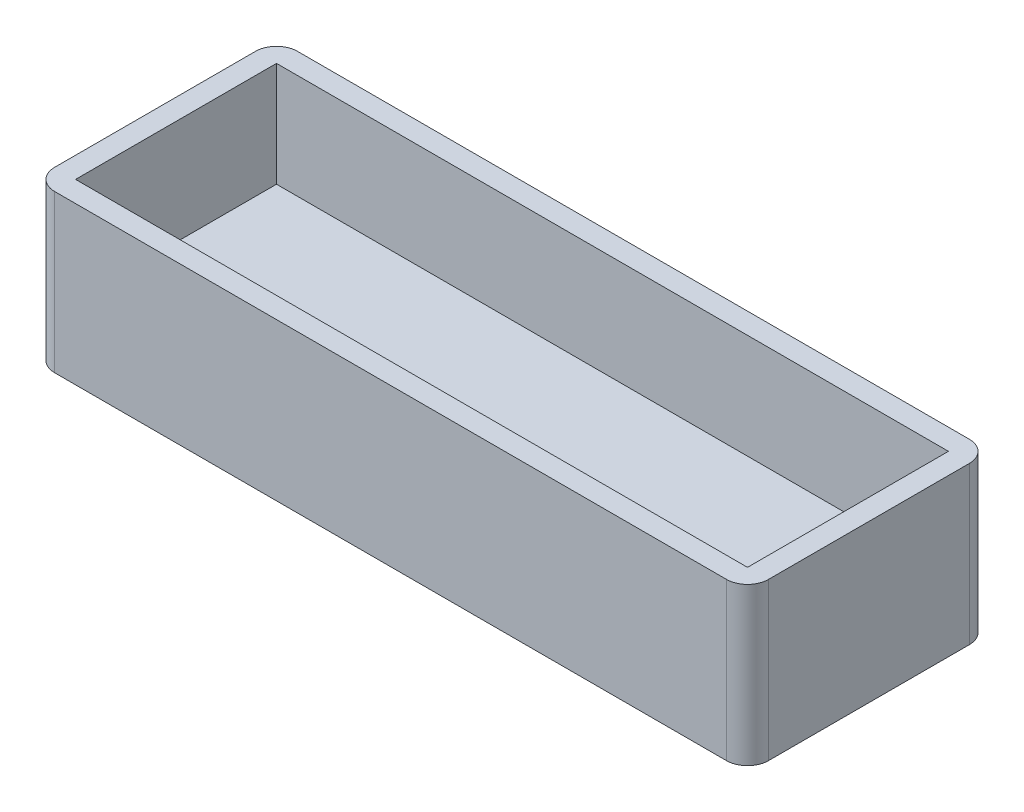
ISO-10303-21;
HEADER;
FILE_DESCRIPTION(('STEP AP214'),'2;1');
FILE_NAME('part.step','',(''),(''),'','','');
FILE_SCHEMA(('AUTOMOTIVE_DESIGN { 1 0 10303 214 1 1 1 1 }'));
ENDSEC;
DATA;
#1=APPLICATION_CONTEXT('core data for automotive mechanical design processes');
#2=APPLICATION_PROTOCOL_DEFINITION('international standard','automotive_design',2000,#1);
#3=PRODUCT_CONTEXT('',#1,'mechanical');
#4=PRODUCT('Part','Part','',(#3));
#5=PRODUCT_RELATED_PRODUCT_CATEGORY('part','',(#4));
#6=PRODUCT_DEFINITION_FORMATION('','',#4);
#7=PRODUCT_DEFINITION_CONTEXT('part definition',#1,'design');
#8=PRODUCT_DEFINITION('design','',#6,#7);
#9=PRODUCT_DEFINITION_SHAPE('','',#8);
#10=(LENGTH_UNIT() NAMED_UNIT(*) SI_UNIT(.MILLI.,.METRE.));
#11=(NAMED_UNIT(*) PLANE_ANGLE_UNIT() SI_UNIT($,.RADIAN.));
#12=(NAMED_UNIT(*) SI_UNIT($,.STERADIAN.) SOLID_ANGLE_UNIT());
#13=UNCERTAINTY_MEASURE_WITH_UNIT(LENGTH_MEASURE(1.E-05),#10,'distance_accuracy_value','');
#14=(GEOMETRIC_REPRESENTATION_CONTEXT(3) GLOBAL_UNCERTAINTY_ASSIGNED_CONTEXT((#13)) GLOBAL_UNIT_ASSIGNED_CONTEXT((#10,
#11,#12)) REPRESENTATION_CONTEXT('',''));
#15=CARTESIAN_POINT('',(0.,0.,0.));
#16=DIRECTION('',(0.,0.,1.));
#17=DIRECTION('',(1.,0.,0.));
#18=AXIS2_PLACEMENT_3D('',#15,#16,#17);
#19=CARTESIAN_POINT('',(0.,10.,0.));
#20=DIRECTION('',(0.,1.,0.));
#21=DIRECTION('',(0.,0.,1.));
#22=AXIS2_PLACEMENT_3D('',#19,#20,#21);
#23=PLANE('',#22);
#24=DIRECTION('',(-1.,0.,0.));
#25=VECTOR('',#24,1.);
#26=CARTESIAN_POINT('',(-2.,10.,-21.2));
#27=LINE('',#26,#25);
#28=CARTESIAN_POINT('',(64.2,10.,-21.2));
#29=VERTEX_POINT('',#28);
#30=CARTESIAN_POINT('',(0.,10.,-21.2));
#31=VERTEX_POINT('',#30);
#32=EDGE_CURVE('E173',#29,#31,#27,.T.);
#33=ORIENTED_EDGE('',*,*,#32,.T.);
#34=CARTESIAN_POINT('',(0.,10.,-19.2));
#35=DIRECTION('',(0.,1.,0.));
#36=DIRECTION('',(0.,0.,1.));
#37=AXIS2_PLACEMENT_3D('',#34,#35,#36);
#38=CIRCLE('',#37,2.);
#39=CARTESIAN_POINT('',(-2.,10.,-19.2));
#40=VERTEX_POINT('',#39);
#41=EDGE_CURVE('E208',#31,#40,#38,.T.);
#42=ORIENTED_EDGE('',*,*,#41,.T.);
#43=DIRECTION('',(0.,0.,1.));
#44=VECTOR('',#43,1.);
#45=CARTESIAN_POINT('',(-2.,10.,2.));
#46=LINE('',#45,#44);
#47=CARTESIAN_POINT('',(-2.,10.,0.));
#48=VERTEX_POINT('',#47);
#49=EDGE_CURVE('E176',#40,#48,#46,.T.);
#50=ORIENTED_EDGE('',*,*,#49,.T.);
#51=CARTESIAN_POINT('',(0.,10.,0.));
#52=DIRECTION('',(0.,1.,0.));
#53=DIRECTION('',(0.,0.,1.));
#54=AXIS2_PLACEMENT_3D('',#51,#52,#53);
#55=CIRCLE('',#54,2.);
#56=CARTESIAN_POINT('',(0.,10.,2.));
#57=VERTEX_POINT('',#56);
#58=EDGE_CURVE('E206',#48,#57,#55,.T.);
#59=ORIENTED_EDGE('',*,*,#58,.T.);
#60=DIRECTION('',(1.,0.,0.));
#61=VECTOR('',#60,1.);
#62=CARTESIAN_POINT('',(-2.,10.,2.));
#63=LINE('',#62,#61);
#64=CARTESIAN_POINT('',(64.2,10.,2.));
#65=VERTEX_POINT('',#64);
#66=EDGE_CURVE('E169',#57,#65,#63,.T.);
#67=ORIENTED_EDGE('',*,*,#66,.T.);
#68=CARTESIAN_POINT('',(64.2,10.,0.));
#69=DIRECTION('',(0.,1.,0.));
#70=DIRECTION('',(0.,0.,1.));
#71=AXIS2_PLACEMENT_3D('',#68,#69,#70);
#72=CIRCLE('',#71,2.);
#73=CARTESIAN_POINT('',(66.2,10.,0.));
#74=VERTEX_POINT('',#73);
#75=EDGE_CURVE('E63',#65,#74,#72,.T.);
#76=ORIENTED_EDGE('',*,*,#75,.T.);
#77=DIRECTION('',(0.,0.,-1.));
#78=VECTOR('',#77,1.);
#79=CARTESIAN_POINT('',(66.2,10.,2.));
#80=LINE('',#79,#78);
#81=CARTESIAN_POINT('',(66.2,10.,-19.2));
#82=VERTEX_POINT('',#81);
#83=EDGE_CURVE('E171',#74,#82,#80,.T.);
#84=ORIENTED_EDGE('',*,*,#83,.T.);
#85=CARTESIAN_POINT('',(64.2,10.,-19.2));
#86=DIRECTION('',(0.,1.,0.));
#87=DIRECTION('',(0.,0.,1.));
#88=AXIS2_PLACEMENT_3D('',#85,#86,#87);
#89=CIRCLE('',#88,2.);
#90=EDGE_CURVE('E204',#82,#29,#89,.T.);
#91=ORIENTED_EDGE('',*,*,#90,.T.);
#92=EDGE_LOOP('',(#33,#42,#50,#59,#67,#76,#84,#91));
#93=FACE_BOUND('',#92,.T.);
#94=DIRECTION('',(1.,0.,0.));
#95=VECTOR('',#94,1.);
#96=CARTESIAN_POINT('',(0.,10.,0.));
#97=LINE('',#96,#95);
#98=CARTESIAN_POINT('',(0.,10.,0.));
#99=VERTEX_POINT('',#98);
#100=CARTESIAN_POINT('',(64.2,10.,0.));
#101=VERTEX_POINT('',#100);
#102=EDGE_CURVE('E160',#99,#101,#97,.T.);
#103=ORIENTED_EDGE('',*,*,#102,.F.);
#104=DIRECTION('',(0.,0.,1.));
#105=VECTOR('',#104,1.);
#106=CARTESIAN_POINT('',(0.,10.,0.));
#107=LINE('',#106,#105);
#108=CARTESIAN_POINT('',(0.,10.,-19.2));
#109=VERTEX_POINT('',#108);
#110=EDGE_CURVE('E158',#109,#99,#107,.T.);
#111=ORIENTED_EDGE('',*,*,#110,.F.);
#112=DIRECTION('',(-1.,0.,0.));
#113=VECTOR('',#112,1.);
#114=CARTESIAN_POINT('',(0.,10.,-19.2));
#115=LINE('',#114,#113);
#116=CARTESIAN_POINT('',(64.2,10.,-19.2));
#117=VERTEX_POINT('',#116);
#118=EDGE_CURVE('E139',#117,#109,#115,.T.);
#119=ORIENTED_EDGE('',*,*,#118,.F.);
#120=DIRECTION('',(0.,0.,-1.));
#121=VECTOR('',#120,1.);
#122=CARTESIAN_POINT('',(64.2,10.,0.));
#123=LINE('',#122,#121);
#124=EDGE_CURVE('E234',#101,#117,#123,.T.);
#125=ORIENTED_EDGE('',*,*,#124,.F.);
#126=EDGE_LOOP('',(#103,#111,#119,#125));
#127=FACE_BOUND('',#126,.T.);
#128=ADVANCED_FACE('F43',(#93,#127),#23,.T.);
#129=CARTESIAN_POINT('',(-2.,10.,2.));
#130=DIRECTION('',(0.,0.,-1.));
#131=DIRECTION('',(-1.,0.,0.));
#132=AXIS2_PLACEMENT_3D('',#129,#130,#131);
#133=PLANE('',#132);
#134=ORIENTED_EDGE('',*,*,#66,.F.);
#135=DIRECTION('',(0.,-1.,0.));
#136=VECTOR('',#135,1.);
#137=CARTESIAN_POINT('',(0.,10.,2.));
#138=LINE('',#137,#136);
#139=CARTESIAN_POINT('',(0.,-5.,2.));
#140=VERTEX_POINT('',#139);
#141=EDGE_CURVE('E212',#57,#140,#138,.T.);
#142=ORIENTED_EDGE('',*,*,#141,.T.);
#143=DIRECTION('',(1.,0.,0.));
#144=VECTOR('',#143,1.);
#145=CARTESIAN_POINT('',(0.,-5.,2.));
#146=LINE('',#145,#144);
#147=CARTESIAN_POINT('',(64.2,-5.,2.));
#148=VERTEX_POINT('',#147);
#149=EDGE_CURVE('E226',#140,#148,#146,.T.);
#150=ORIENTED_EDGE('',*,*,#149,.T.);
#151=DIRECTION('',(0.,-1.,0.));
#152=VECTOR('',#151,1.);
#153=CARTESIAN_POINT('',(64.2,10.,2.));
#154=LINE('',#153,#152);
#155=EDGE_CURVE('E210',#148,#65,#154,.F.);
#156=ORIENTED_EDGE('',*,*,#155,.T.);
#157=EDGE_LOOP('',(#134,#142,#150,#156));
#158=FACE_BOUND('',#157,.T.);
#159=ADVANCED_FACE('F246',(#158),#133,.F.);
#160=CARTESIAN_POINT('',(66.2,10.,2.));
#161=DIRECTION('',(-1.,0.,0.));
#162=DIRECTION('',(0.,0.,1.));
#163=AXIS2_PLACEMENT_3D('',#160,#161,#162);
#164=PLANE('',#163);
#165=DIRECTION('',(0.,0.,-1.));
#166=VECTOR('',#165,1.);
#167=CARTESIAN_POINT('',(66.2,-5.,0.));
#168=LINE('',#167,#166);
#169=CARTESIAN_POINT('',(66.2,-5.,0.));
#170=VERTEX_POINT('',#169);
#171=CARTESIAN_POINT('',(66.2,-5.,-19.2));
#172=VERTEX_POINT('',#171);
#173=EDGE_CURVE('E218',#170,#172,#168,.T.);
#174=ORIENTED_EDGE('',*,*,#173,.T.);
#175=DIRECTION('',(0.,-1.,0.));
#176=VECTOR('',#175,1.);
#177=CARTESIAN_POINT('',(66.2,10.,-19.2));
#178=LINE('',#177,#176);
#179=EDGE_CURVE('E11',#172,#82,#178,.F.);
#180=ORIENTED_EDGE('',*,*,#179,.T.);
#181=ORIENTED_EDGE('',*,*,#83,.F.);
#182=DIRECTION('',(0.,-1.,0.));
#183=VECTOR('',#182,1.);
#184=CARTESIAN_POINT('',(66.2,10.,0.));
#185=LINE('',#184,#183);
#186=EDGE_CURVE('E51',#74,#170,#185,.T.);
#187=ORIENTED_EDGE('',*,*,#186,.T.);
#188=EDGE_LOOP('',(#174,#180,#181,#187));
#189=FACE_BOUND('',#188,.T.);
#190=ADVANCED_FACE('F217',(#189),#164,.F.);
#191=CARTESIAN_POINT('',(-2.,10.,-21.2));
#192=DIRECTION('',(0.,0.,1.));
#193=DIRECTION('',(1.,0.,0.));
#194=AXIS2_PLACEMENT_3D('',#191,#192,#193);
#195=PLANE('',#194);
#196=DIRECTION('',(1.,0.,0.));
#197=VECTOR('',#196,1.);
#198=CARTESIAN_POINT('',(0.,-5.,-21.2));
#199=LINE('',#198,#197);
#200=CARTESIAN_POINT('',(0.,-5.,-21.2));
#201=VERTEX_POINT('',#200);
#202=CARTESIAN_POINT('',(64.2,-5.,-21.2));
#203=VERTEX_POINT('',#202);
#204=EDGE_CURVE('E153',#201,#203,#199,.T.);
#205=ORIENTED_EDGE('',*,*,#204,.F.);
#206=DIRECTION('',(0.,-1.,0.));
#207=VECTOR('',#206,1.);
#208=CARTESIAN_POINT('',(0.,10.,-21.2));
#209=LINE('',#208,#207);
#210=EDGE_CURVE('E201',#201,#31,#209,.F.);
#211=ORIENTED_EDGE('',*,*,#210,.T.);
#212=ORIENTED_EDGE('',*,*,#32,.F.);
#213=DIRECTION('',(0.,-1.,0.));
#214=VECTOR('',#213,1.);
#215=CARTESIAN_POINT('',(64.2,10.,-21.2));
#216=LINE('',#215,#214);
#217=EDGE_CURVE('E198',#29,#203,#216,.T.);
#218=ORIENTED_EDGE('',*,*,#217,.T.);
#219=EDGE_LOOP('',(#205,#211,#212,#218));
#220=FACE_BOUND('',#219,.T.);
#221=ADVANCED_FACE('F260',(#220),#195,.F.);
#222=CARTESIAN_POINT('',(-2.,10.,2.));
#223=DIRECTION('',(1.,0.,0.));
#224=DIRECTION('',(0.,0.,-1.));
#225=AXIS2_PLACEMENT_3D('',#222,#223,#224);
#226=PLANE('',#225);
#227=ORIENTED_EDGE('',*,*,#49,.F.);
#228=DIRECTION('',(0.,-1.,0.));
#229=VECTOR('',#228,1.);
#230=CARTESIAN_POINT('',(-2.,10.,-19.2));
#231=LINE('',#230,#229);
#232=CARTESIAN_POINT('',(-2.,-5.,-19.2));
#233=VERTEX_POINT('',#232);
#234=EDGE_CURVE('E187',#40,#233,#231,.T.);
#235=ORIENTED_EDGE('',*,*,#234,.T.);
#236=DIRECTION('',(0.,0.,-1.));
#237=VECTOR('',#236,1.);
#238=CARTESIAN_POINT('',(-2.,-5.,0.));
#239=LINE('',#238,#237);
#240=CARTESIAN_POINT('',(-2.,-5.,0.));
#241=VERTEX_POINT('',#240);
#242=EDGE_CURVE('E229',#241,#233,#239,.T.);
#243=ORIENTED_EDGE('',*,*,#242,.F.);
#244=DIRECTION('',(0.,-1.,0.));
#245=VECTOR('',#244,1.);
#246=CARTESIAN_POINT('',(-2.,10.,0.));
#247=LINE('',#246,#245);
#248=EDGE_CURVE('E185',#241,#48,#247,.F.);
#249=ORIENTED_EDGE('',*,*,#248,.T.);
#250=EDGE_LOOP('',(#227,#235,#243,#249));
#251=FACE_BOUND('',#250,.T.);
#252=ADVANCED_FACE('F257',(#251),#226,.F.);
#253=CARTESIAN_POINT('',(0.,10.,0.));
#254=DIRECTION('',(1.,0.,0.));
#255=DIRECTION('',(0.,0.,-1.));
#256=AXIS2_PLACEMENT_3D('',#253,#254,#255);
#257=PLANE('',#256);
#258=DIRECTION('',(0.,0.,1.));
#259=VECTOR('',#258,1.);
#260=CARTESIAN_POINT('',(0.,0.,0.));
#261=LINE('',#260,#259);
#262=CARTESIAN_POINT('',(0.,0.,-19.2));
#263=VERTEX_POINT('',#262);
#264=CARTESIAN_POINT('',(0.,0.,0.));
#265=VERTEX_POINT('',#264);
#266=EDGE_CURVE('E146',#263,#265,#261,.T.);
#267=ORIENTED_EDGE('',*,*,#266,.F.);
#268=DIRECTION('',(0.,-1.,0.));
#269=VECTOR('',#268,1.);
#270=CARTESIAN_POINT('',(0.,10.,-19.2));
#271=LINE('',#270,#269);
#272=EDGE_CURVE('E132',#109,#263,#271,.T.);
#273=ORIENTED_EDGE('',*,*,#272,.F.);
#274=ORIENTED_EDGE('',*,*,#110,.T.);
#275=DIRECTION('',(0.,-1.,0.));
#276=VECTOR('',#275,1.);
#277=CARTESIAN_POINT('',(0.,10.,0.));
#278=LINE('',#277,#276);
#279=EDGE_CURVE('E149',#99,#265,#278,.T.);
#280=ORIENTED_EDGE('',*,*,#279,.T.);
#281=EDGE_LOOP('',(#267,#273,#274,#280));
#282=FACE_BOUND('',#281,.T.);
#283=ADVANCED_FACE('F147',(#282),#257,.T.);
#284=CARTESIAN_POINT('',(0.,10.,0.));
#285=DIRECTION('',(0.,0.,-1.));
#286=DIRECTION('',(-1.,0.,0.));
#287=AXIS2_PLACEMENT_3D('',#284,#285,#286);
#288=PLANE('',#287);
#289=DIRECTION('',(1.,0.,0.));
#290=VECTOR('',#289,1.);
#291=CARTESIAN_POINT('',(0.,0.,0.));
#292=LINE('',#291,#290);
#293=CARTESIAN_POINT('',(64.2,0.,0.));
#294=VERTEX_POINT('',#293);
#295=EDGE_CURVE('E152',#265,#294,#292,.T.);
#296=ORIENTED_EDGE('',*,*,#295,.F.);
#297=ORIENTED_EDGE('',*,*,#279,.F.);
#298=ORIENTED_EDGE('',*,*,#102,.T.);
#299=DIRECTION('',(0.,-1.,0.));
#300=VECTOR('',#299,1.);
#301=CARTESIAN_POINT('',(64.2,10.,0.));
#302=LINE('',#301,#300);
#303=EDGE_CURVE('E166',#101,#294,#302,.T.);
#304=ORIENTED_EDGE('',*,*,#303,.T.);
#305=EDGE_LOOP('',(#296,#297,#298,#304));
#306=FACE_BOUND('',#305,.T.);
#307=ADVANCED_FACE('F238',(#306),#288,.T.);
#308=CARTESIAN_POINT('',(64.2,10.,0.));
#309=DIRECTION('',(-1.,0.,0.));
#310=DIRECTION('',(0.,0.,1.));
#311=AXIS2_PLACEMENT_3D('',#308,#309,#310);
#312=PLANE('',#311);
#313=DIRECTION('',(0.,0.,-1.));
#314=VECTOR('',#313,1.);
#315=CARTESIAN_POINT('',(64.2,0.,0.));
#316=LINE('',#315,#314);
#317=CARTESIAN_POINT('',(64.2,0.,-19.2));
#318=VERTEX_POINT('',#317);
#319=EDGE_CURVE('E157',#294,#318,#316,.T.);
#320=ORIENTED_EDGE('',*,*,#319,.F.);
#321=ORIENTED_EDGE('',*,*,#303,.F.);
#322=ORIENTED_EDGE('',*,*,#124,.T.);
#323=DIRECTION('',(0.,-1.,0.));
#324=VECTOR('',#323,1.);
#325=CARTESIAN_POINT('',(64.2,10.,-19.2));
#326=LINE('',#325,#324);
#327=EDGE_CURVE('E142',#117,#318,#326,.T.);
#328=ORIENTED_EDGE('',*,*,#327,.T.);
#329=EDGE_LOOP('',(#320,#321,#322,#328));
#330=FACE_BOUND('',#329,.T.);
#331=ADVANCED_FACE('F243',(#330),#312,.T.);
#332=CARTESIAN_POINT('',(0.,10.,-19.2));
#333=DIRECTION('',(0.,0.,1.));
#334=DIRECTION('',(1.,0.,0.));
#335=AXIS2_PLACEMENT_3D('',#332,#333,#334);
#336=PLANE('',#335);
#337=DIRECTION('',(-1.,0.,0.));
#338=VECTOR('',#337,1.);
#339=CARTESIAN_POINT('',(0.,0.,-19.2));
#340=LINE('',#339,#338);
#341=EDGE_CURVE('E136',#318,#263,#340,.T.);
#342=ORIENTED_EDGE('',*,*,#341,.F.);
#343=ORIENTED_EDGE('',*,*,#327,.F.);
#344=ORIENTED_EDGE('',*,*,#118,.T.);
#345=ORIENTED_EDGE('',*,*,#272,.T.);
#346=EDGE_LOOP('',(#342,#343,#344,#345));
#347=FACE_BOUND('',#346,.T.);
#348=ADVANCED_FACE('F134',(#347),#336,.T.);
#349=CARTESIAN_POINT('',(0.,0.,0.));
#350=DIRECTION('',(0.,1.,0.));
#351=DIRECTION('',(0.,0.,1.));
#352=AXIS2_PLACEMENT_3D('',#349,#350,#351);
#353=PLANE('',#352);
#354=ORIENTED_EDGE('',*,*,#341,.T.);
#355=ORIENTED_EDGE('',*,*,#266,.T.);
#356=ORIENTED_EDGE('',*,*,#295,.T.);
#357=ORIENTED_EDGE('',*,*,#319,.T.);
#358=EDGE_LOOP('',(#354,#355,#356,#357));
#359=FACE_BOUND('',#358,.T.);
#360=ADVANCED_FACE('F155',(#359),#353,.T.);
#361=CARTESIAN_POINT('',(0.,-5.,0.));
#362=DIRECTION('',(0.,1.,0.));
#363=DIRECTION('',(0.,0.,1.));
#364=AXIS2_PLACEMENT_3D('',#361,#362,#363);
#365=PLANE('',#364);
#366=CARTESIAN_POINT('',(49.6,-5.,-9.59999999999999));
#367=DIRECTION('',(0.,1.,0.));
#368=DIRECTION('',(0.,0.,1.));
#369=AXIS2_PLACEMENT_3D('',#366,#367,#368);
#370=CIRCLE('',#369,2.5);
#371=CARTESIAN_POINT('',(49.6,-5.,-7.09999999999999));
#372=VERTEX_POINT('',#371);
#373=EDGE_CURVE('E182',#372,#372,#370,.F.);
#374=ORIENTED_EDGE('',*,*,#373,.F.);
#375=EDGE_LOOP('',(#374));
#376=FACE_BOUND('',#375,.T.);
#377=CARTESIAN_POINT('',(14.6,-5.,-9.6));
#378=DIRECTION('',(0.,1.,0.));
#379=DIRECTION('',(0.,0.,1.));
#380=AXIS2_PLACEMENT_3D('',#377,#378,#379);
#381=CIRCLE('',#380,2.5);
#382=CARTESIAN_POINT('',(14.6,-5.,-7.1));
#383=VERTEX_POINT('',#382);
#384=EDGE_CURVE('E179',#383,#383,#381,.F.);
#385=ORIENTED_EDGE('',*,*,#384,.F.);
#386=EDGE_LOOP('',(#385));
#387=FACE_BOUND('',#386,.T.);
#388=ORIENTED_EDGE('',*,*,#242,.T.);
#389=CARTESIAN_POINT('',(0.,-5.,-19.2));
#390=DIRECTION('',(0.,1.,0.));
#391=DIRECTION('',(0.,0.,1.));
#392=AXIS2_PLACEMENT_3D('',#389,#390,#391);
#393=CIRCLE('',#392,2.);
#394=EDGE_CURVE('E196',#233,#201,#393,.F.);
#395=ORIENTED_EDGE('',*,*,#394,.T.);
#396=ORIENTED_EDGE('',*,*,#204,.T.);
#397=CARTESIAN_POINT('',(64.2,-5.,-19.2));
#398=DIRECTION('',(0.,1.,0.));
#399=DIRECTION('',(0.,0.,1.));
#400=AXIS2_PLACEMENT_3D('',#397,#398,#399);
#401=CIRCLE('',#400,2.);
#402=EDGE_CURVE('E192',#203,#172,#401,.F.);
#403=ORIENTED_EDGE('',*,*,#402,.T.);
#404=ORIENTED_EDGE('',*,*,#173,.F.);
#405=CARTESIAN_POINT('',(64.2,-5.,0.));
#406=DIRECTION('',(0.,1.,0.));
#407=DIRECTION('',(0.,0.,1.));
#408=AXIS2_PLACEMENT_3D('',#405,#406,#407);
#409=CIRCLE('',#408,2.);
#410=EDGE_CURVE('E190',#170,#148,#409,.F.);
#411=ORIENTED_EDGE('',*,*,#410,.T.);
#412=ORIENTED_EDGE('',*,*,#149,.F.);
#413=CARTESIAN_POINT('',(0.,-5.,0.));
#414=DIRECTION('',(0.,1.,0.));
#415=DIRECTION('',(0.,0.,1.));
#416=AXIS2_PLACEMENT_3D('',#413,#414,#415);
#417=CIRCLE('',#416,2.);
#418=EDGE_CURVE('E194',#140,#241,#417,.F.);
#419=ORIENTED_EDGE('',*,*,#418,.T.);
#420=EDGE_LOOP('',(#388,#395,#396,#403,#404,#411,#412,#419));
#421=FACE_BOUND('',#420,.T.);
#422=ADVANCED_FACE('F222',(#376,#387,#421),#365,.F.);
#423=CARTESIAN_POINT('',(14.6,-10.,-9.6));
#424=DIRECTION('',(0.,1.,0.));
#425=DIRECTION('',(0.,0.,1.));
#426=AXIS2_PLACEMENT_3D('',#423,#424,#425);
#427=CYLINDRICAL_SURFACE('',#426,2.5);
#428=CARTESIAN_POINT('',(14.6,-10.,-9.6));
#429=DIRECTION('',(0.,-1.,0.));
#430=DIRECTION('',(0.,0.,-1.));
#431=AXIS2_PLACEMENT_3D('',#428,#429,#430);
#432=CIRCLE('',#431,2.5);
#433=CARTESIAN_POINT('',(14.6,-10.,-12.1));
#434=VERTEX_POINT('',#433);
#435=EDGE_CURVE('E295',#434,#434,#432,.T.);
#436=ORIENTED_EDGE('',*,*,#435,.F.);
#437=EDGE_LOOP('',(#436));
#438=FACE_BOUND('',#437,.T.);
#439=ORIENTED_EDGE('',*,*,#384,.T.);
#440=EDGE_LOOP('',(#439));
#441=FACE_BOUND('',#440,.T.);
#442=ADVANCED_FACE('F313',(#438,#441),#427,.T.);
#443=CARTESIAN_POINT('',(14.6,-10.,-9.6));
#444=DIRECTION('',(0.,-1.,0.));
#445=DIRECTION('',(0.,0.,-1.));
#446=AXIS2_PLACEMENT_3D('',#443,#444,#445);
#447=PLANE('',#446);
#448=ORIENTED_EDGE('',*,*,#435,.T.);
#449=EDGE_LOOP('',(#448));
#450=FACE_BOUND('',#449,.T.);
#451=ADVANCED_FACE('F307',(#450),#447,.T.);
#452=CARTESIAN_POINT('',(49.6,-10.,-9.59999999999999));
#453=DIRECTION('',(0.,1.,0.));
#454=DIRECTION('',(0.,0.,1.));
#455=AXIS2_PLACEMENT_3D('',#452,#453,#454);
#456=CYLINDRICAL_SURFACE('',#455,2.5);
#457=CARTESIAN_POINT('',(49.6,-10.,-9.59999999999999));
#458=DIRECTION('',(0.,-1.,0.));
#459=DIRECTION('',(0.,0.,1.));
#460=AXIS2_PLACEMENT_3D('',#457,#458,#459);
#461=CIRCLE('',#460,2.5);
#462=CARTESIAN_POINT('',(49.6,-10.,-7.09999999999999));
#463=VERTEX_POINT('',#462);
#464=EDGE_CURVE('E297',#463,#463,#461,.T.);
#465=ORIENTED_EDGE('',*,*,#464,.F.);
#466=EDGE_LOOP('',(#465));
#467=FACE_BOUND('',#466,.T.);
#468=ORIENTED_EDGE('',*,*,#373,.T.);
#469=EDGE_LOOP('',(#468));
#470=FACE_BOUND('',#469,.T.);
#471=ADVANCED_FACE('F304',(#467,#470),#456,.T.);
#472=CARTESIAN_POINT('',(49.6,-10.,-9.59999999999999));
#473=DIRECTION('',(0.,1.,0.));
#474=DIRECTION('',(0.,0.,1.));
#475=AXIS2_PLACEMENT_3D('',#472,#473,#474);
#476=PLANE('',#475);
#477=ORIENTED_EDGE('',*,*,#464,.T.);
#478=EDGE_LOOP('',(#477));
#479=FACE_BOUND('',#478,.T.);
#480=ADVANCED_FACE('F271',(#479),#476,.F.);
#481=CARTESIAN_POINT('',(0.,10.,-19.2));
#482=DIRECTION('',(0.,-1.,0.));
#483=DIRECTION('',(0.,0.,-1.));
#484=AXIS2_PLACEMENT_3D('',#481,#482,#483);
#485=CYLINDRICAL_SURFACE('',#484,2.);
#486=ORIENTED_EDGE('',*,*,#41,.F.);
#487=ORIENTED_EDGE('',*,*,#210,.F.);
#488=ORIENTED_EDGE('',*,*,#394,.F.);
#489=ORIENTED_EDGE('',*,*,#234,.F.);
#490=EDGE_LOOP('',(#486,#487,#488,#489));
#491=FACE_BOUND('',#490,.T.);
#492=ADVANCED_FACE('F267',(#491),#485,.T.);
#493=CARTESIAN_POINT('',(0.,10.,0.));
#494=DIRECTION('',(0.,-1.,0.));
#495=DIRECTION('',(0.,0.,-1.));
#496=AXIS2_PLACEMENT_3D('',#493,#494,#495);
#497=CYLINDRICAL_SURFACE('',#496,2.);
#498=ORIENTED_EDGE('',*,*,#58,.F.);
#499=ORIENTED_EDGE('',*,*,#248,.F.);
#500=ORIENTED_EDGE('',*,*,#418,.F.);
#501=ORIENTED_EDGE('',*,*,#141,.F.);
#502=EDGE_LOOP('',(#498,#499,#500,#501));
#503=FACE_BOUND('',#502,.T.);
#504=ADVANCED_FACE('F270',(#503),#497,.T.);
#505=CARTESIAN_POINT('',(64.2,10.,-19.2));
#506=DIRECTION('',(0.,-1.,0.));
#507=DIRECTION('',(0.,0.,-1.));
#508=AXIS2_PLACEMENT_3D('',#505,#506,#507);
#509=CYLINDRICAL_SURFACE('',#508,2.);
#510=ORIENTED_EDGE('',*,*,#90,.F.);
#511=ORIENTED_EDGE('',*,*,#179,.F.);
#512=ORIENTED_EDGE('',*,*,#402,.F.);
#513=ORIENTED_EDGE('',*,*,#217,.F.);
#514=EDGE_LOOP('',(#510,#511,#512,#513));
#515=FACE_BOUND('',#514,.T.);
#516=ADVANCED_FACE('F274',(#515),#509,.T.);
#517=CARTESIAN_POINT('',(64.2,10.,0.));
#518=DIRECTION('',(0.,-1.,0.));
#519=DIRECTION('',(0.,0.,-1.));
#520=AXIS2_PLACEMENT_3D('',#517,#518,#519);
#521=CYLINDRICAL_SURFACE('',#520,2.);
#522=ORIENTED_EDGE('',*,*,#75,.F.);
#523=ORIENTED_EDGE('',*,*,#155,.F.);
#524=ORIENTED_EDGE('',*,*,#410,.F.);
#525=ORIENTED_EDGE('',*,*,#186,.F.);
#526=EDGE_LOOP('',(#522,#523,#524,#525));
#527=FACE_BOUND('',#526,.T.);
#528=ADVANCED_FACE('F45',(#527),#521,.T.);
#529=CLOSED_SHELL('',(#128,#159,#190,#221,#252,#283,#307,#331,#348,#360,#422,#442,#451,#471,
#480,#492,#504,#516,#528));
#530=MANIFOLD_SOLID_BREP('B2',#529);
#531=ADVANCED_BREP_SHAPE_REPRESENTATION('',(#18,#530),#14);
#532=SHAPE_DEFINITION_REPRESENTATION(#9,#531);
ENDSEC;
END-ISO-10303-21;
